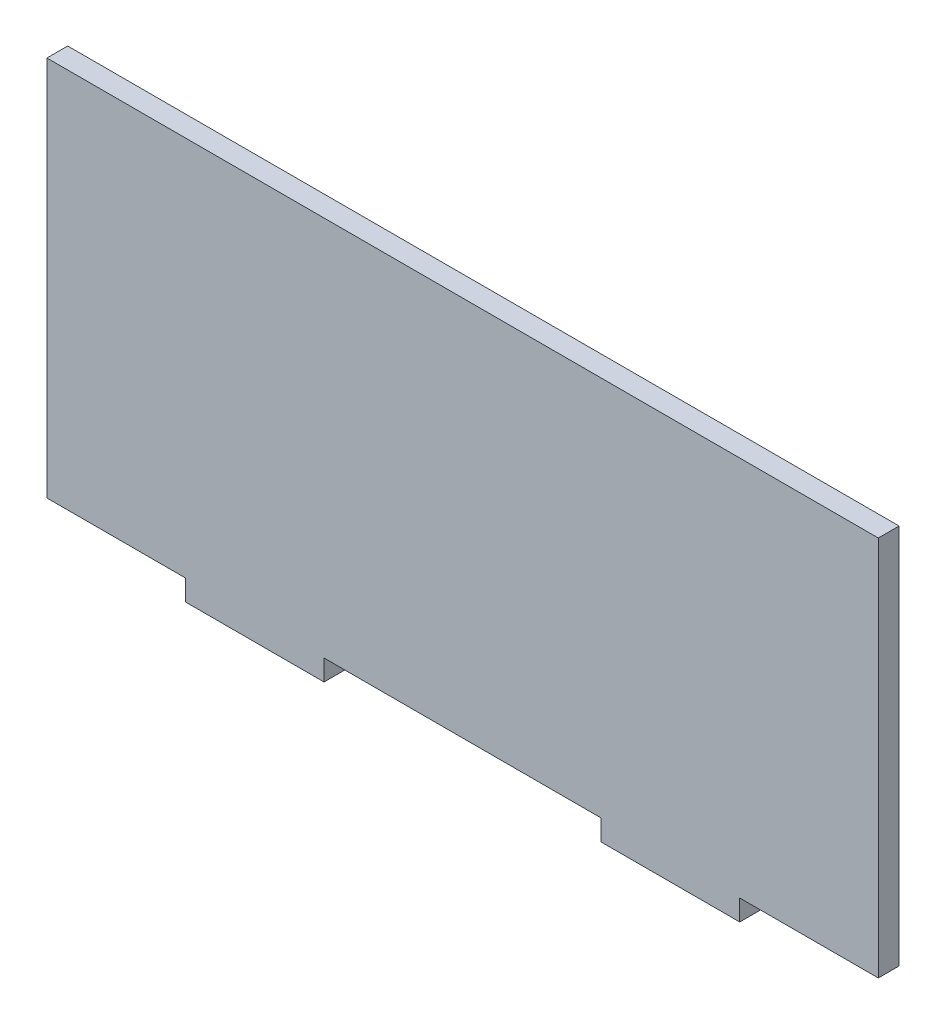
ISO-10303-21;
HEADER;
FILE_DESCRIPTION(('STEP AP214'),'2;1');
FILE_NAME('part.step','',(''),(''),'','','');
FILE_SCHEMA(('AUTOMOTIVE_DESIGN { 1 0 10303 214 1 1 1 1 }'));
ENDSEC;
DATA;
#1=APPLICATION_CONTEXT('core data for automotive mechanical design processes');
#2=APPLICATION_PROTOCOL_DEFINITION('international standard','automotive_design',2000,#1);
#3=PRODUCT_CONTEXT('',#1,'mechanical');
#4=PRODUCT('Part','Part','',(#3));
#5=PRODUCT_RELATED_PRODUCT_CATEGORY('part','',(#4));
#6=PRODUCT_DEFINITION_FORMATION('','',#4);
#7=PRODUCT_DEFINITION_CONTEXT('part definition',#1,'design');
#8=PRODUCT_DEFINITION('design','',#6,#7);
#9=PRODUCT_DEFINITION_SHAPE('','',#8);
#10=(LENGTH_UNIT() NAMED_UNIT(*) SI_UNIT(.MILLI.,.METRE.));
#11=(NAMED_UNIT(*) PLANE_ANGLE_UNIT() SI_UNIT($,.RADIAN.));
#12=(NAMED_UNIT(*) SI_UNIT($,.STERADIAN.) SOLID_ANGLE_UNIT());
#13=UNCERTAINTY_MEASURE_WITH_UNIT(LENGTH_MEASURE(1.E-05),#10,'distance_accuracy_value','');
#14=(GEOMETRIC_REPRESENTATION_CONTEXT(3) GLOBAL_UNCERTAINTY_ASSIGNED_CONTEXT((#13)) GLOBAL_UNIT_ASSIGNED_CONTEXT((#10,
#11,#12)) REPRESENTATION_CONTEXT('',''));
#15=CARTESIAN_POINT('',(0.,0.,0.));
#16=DIRECTION('',(0.,0.,1.));
#17=DIRECTION('',(1.,0.,0.));
#18=AXIS2_PLACEMENT_3D('',#15,#16,#17);
#19=CARTESIAN_POINT('',(0.,0.,-3.));
#20=DIRECTION('',(0.,-1.,0.));
#21=DIRECTION('',(0.,0.,-1.));
#22=AXIS2_PLACEMENT_3D('',#19,#20,#21);
#23=PLANE('',#22);
#24=DIRECTION('',(0.,0.,1.));
#25=VECTOR('',#24,1.);
#26=CARTESIAN_POINT('',(80.,0.,-3.));
#27=LINE('',#26,#25);
#28=CARTESIAN_POINT('',(80.,0.,-3.));
#29=VERTEX_POINT('',#28);
#30=CARTESIAN_POINT('',(80.,0.,0.));
#31=VERTEX_POINT('',#30);
#32=EDGE_CURVE('E147',#29,#31,#27,.T.);
#33=ORIENTED_EDGE('',*,*,#32,.T.);
#34=DIRECTION('',(1.,0.,0.));
#35=VECTOR('',#34,1.);
#36=CARTESIAN_POINT('',(0.,0.,0.));
#37=LINE('',#36,#35);
#38=CARTESIAN_POINT('',(40.,0.,0.));
#39=VERTEX_POINT('',#38);
#40=EDGE_CURVE('E205',#39,#31,#37,.T.);
#41=ORIENTED_EDGE('',*,*,#40,.F.);
#42=DIRECTION('',(0.,0.,1.));
#43=VECTOR('',#42,1.);
#44=CARTESIAN_POINT('',(40.,0.,-3.));
#45=LINE('',#44,#43);
#46=CARTESIAN_POINT('',(40.,0.,-3.));
#47=VERTEX_POINT('',#46);
#48=EDGE_CURVE('E178',#47,#39,#45,.T.);
#49=ORIENTED_EDGE('',*,*,#48,.F.);
#50=DIRECTION('',(1.,0.,0.));
#51=VECTOR('',#50,1.);
#52=CARTESIAN_POINT('',(0.,0.,-3.));
#53=LINE('',#52,#51);
#54=EDGE_CURVE('E192',#47,#29,#53,.T.);
#55=ORIENTED_EDGE('',*,*,#54,.T.);
#56=EDGE_LOOP('',(#33,#41,#49,#55));
#57=FACE_BOUND('',#56,.T.);
#58=ADVANCED_FACE('F33',(#57),#23,.T.);
#59=CARTESIAN_POINT('',(0.,0.,-3.));
#60=VERTEX_POINT('',#59);
#61=CARTESIAN_POINT('',(20.,0.,-3.));
#62=VERTEX_POINT('',#61);
#63=EDGE_CURVE('E188',#60,#62,#53,.T.);
#64=ORIENTED_EDGE('',*,*,#63,.T.);
#65=DIRECTION('',(0.,0.,1.));
#66=VECTOR('',#65,1.);
#67=CARTESIAN_POINT('',(20.,0.,-3.));
#68=LINE('',#67,#66);
#69=CARTESIAN_POINT('',(20.,0.,0.));
#70=VERTEX_POINT('',#69);
#71=EDGE_CURVE('E175',#62,#70,#68,.T.);
#72=ORIENTED_EDGE('',*,*,#71,.T.);
#73=CARTESIAN_POINT('',(0.,0.,0.));
#74=VERTEX_POINT('',#73);
#75=EDGE_CURVE('E201',#74,#70,#37,.T.);
#76=ORIENTED_EDGE('',*,*,#75,.F.);
#77=DIRECTION('',(0.,0.,1.));
#78=VECTOR('',#77,1.);
#79=CARTESIAN_POINT('',(0.,0.,-3.));
#80=LINE('',#79,#78);
#81=EDGE_CURVE('E37',#60,#74,#80,.T.);
#82=ORIENTED_EDGE('',*,*,#81,.F.);
#83=EDGE_LOOP('',(#64,#72,#76,#82));
#84=FACE_BOUND('',#83,.T.);
#85=ADVANCED_FACE('F221',(#84),#23,.T.);
#86=CARTESIAN_POINT('',(0.,0.,-3.));
#87=DIRECTION('',(-1.,0.,0.));
#88=DIRECTION('',(0.,0.,1.));
#89=AXIS2_PLACEMENT_3D('',#86,#87,#88);
#90=PLANE('',#89);
#91=DIRECTION('',(0.,-1.,0.));
#92=VECTOR('',#91,1.);
#93=CARTESIAN_POINT('',(0.,0.,0.));
#94=LINE('',#93,#92);
#95=CARTESIAN_POINT('',(0.,55.,0.));
#96=VERTEX_POINT('',#95);
#97=EDGE_CURVE('E177',#96,#74,#94,.T.);
#98=ORIENTED_EDGE('',*,*,#97,.F.);
#99=DIRECTION('',(0.,0.,1.));
#100=VECTOR('',#99,1.);
#101=CARTESIAN_POINT('',(0.,55.,-3.));
#102=LINE('',#101,#100);
#103=CARTESIAN_POINT('',(0.,55.,-3.));
#104=VERTEX_POINT('',#103);
#105=EDGE_CURVE('E11',#104,#96,#102,.T.);
#106=ORIENTED_EDGE('',*,*,#105,.F.);
#107=DIRECTION('',(0.,-1.,0.));
#108=VECTOR('',#107,1.);
#109=CARTESIAN_POINT('',(0.,0.,-3.));
#110=LINE('',#109,#108);
#111=EDGE_CURVE('E183',#104,#60,#110,.T.);
#112=ORIENTED_EDGE('',*,*,#111,.T.);
#113=ORIENTED_EDGE('',*,*,#81,.T.);
#114=EDGE_LOOP('',(#98,#106,#112,#113));
#115=FACE_BOUND('',#114,.T.);
#116=ADVANCED_FACE('F35',(#115),#90,.T.);
#117=CARTESIAN_POINT('',(0.,55.,-3.));
#118=DIRECTION('',(0.,1.,0.));
#119=DIRECTION('',(0.,0.,1.));
#120=AXIS2_PLACEMENT_3D('',#117,#118,#119);
#121=PLANE('',#120);
#122=DIRECTION('',(-1.,0.,0.));
#123=VECTOR('',#122,1.);
#124=CARTESIAN_POINT('',(0.,55.,0.));
#125=LINE('',#124,#123);
#126=CARTESIAN_POINT('',(120.,55.,0.));
#127=VERTEX_POINT('',#126);
#128=EDGE_CURVE('E187',#127,#96,#125,.T.);
#129=ORIENTED_EDGE('',*,*,#128,.F.);
#130=DIRECTION('',(0.,0.,1.));
#131=VECTOR('',#130,1.);
#132=CARTESIAN_POINT('',(120.,55.,-3.));
#133=LINE('',#132,#131);
#134=CARTESIAN_POINT('',(120.,55.,-3.));
#135=VERTEX_POINT('',#134);
#136=EDGE_CURVE('E42',#135,#127,#133,.T.);
#137=ORIENTED_EDGE('',*,*,#136,.F.);
#138=DIRECTION('',(-1.,0.,0.));
#139=VECTOR('',#138,1.);
#140=CARTESIAN_POINT('',(0.,55.,-3.));
#141=LINE('',#140,#139);
#142=EDGE_CURVE('E195',#135,#104,#141,.T.);
#143=ORIENTED_EDGE('',*,*,#142,.T.);
#144=ORIENTED_EDGE('',*,*,#105,.T.);
#145=EDGE_LOOP('',(#129,#137,#143,#144));
#146=FACE_BOUND('',#145,.T.);
#147=ADVANCED_FACE('F225',(#146),#121,.T.);
#148=CARTESIAN_POINT('',(120.,0.,-3.));
#149=DIRECTION('',(1.,0.,0.));
#150=DIRECTION('',(0.,0.,-1.));
#151=AXIS2_PLACEMENT_3D('',#148,#149,#150);
#152=PLANE('',#151);
#153=DIRECTION('',(0.,1.,0.));
#154=VECTOR('',#153,1.);
#155=CARTESIAN_POINT('',(120.,0.,0.));
#156=LINE('',#155,#154);
#157=CARTESIAN_POINT('',(120.,0.,0.));
#158=VERTEX_POINT('',#157);
#159=EDGE_CURVE('E204',#158,#127,#156,.T.);
#160=ORIENTED_EDGE('',*,*,#159,.F.);
#161=DIRECTION('',(0.,0.,1.));
#162=VECTOR('',#161,1.);
#163=CARTESIAN_POINT('',(120.,0.,-3.));
#164=LINE('',#163,#162);
#165=CARTESIAN_POINT('',(120.,0.,-3.));
#166=VERTEX_POINT('',#165);
#167=EDGE_CURVE('E210',#166,#158,#164,.T.);
#168=ORIENTED_EDGE('',*,*,#167,.F.);
#169=DIRECTION('',(0.,1.,0.));
#170=VECTOR('',#169,1.);
#171=CARTESIAN_POINT('',(120.,0.,-3.));
#172=LINE('',#171,#170);
#173=EDGE_CURVE('E191',#166,#135,#172,.T.);
#174=ORIENTED_EDGE('',*,*,#173,.T.);
#175=ORIENTED_EDGE('',*,*,#136,.T.);
#176=EDGE_LOOP('',(#160,#168,#174,#175));
#177=FACE_BOUND('',#176,.T.);
#178=ADVANCED_FACE('F260',(#177),#152,.T.);
#179=DIRECTION('',(0.,0.,1.));
#180=VECTOR('',#179,1.);
#181=CARTESIAN_POINT('',(100.,0.,-3.));
#182=LINE('',#181,#180);
#183=CARTESIAN_POINT('',(100.,0.,-3.));
#184=VERTEX_POINT('',#183);
#185=CARTESIAN_POINT('',(99.9999999999999,0.,0.));
#186=VERTEX_POINT('',#185);
#187=EDGE_CURVE('E156',#184,#186,#182,.T.);
#188=ORIENTED_EDGE('',*,*,#187,.F.);
#189=EDGE_CURVE('E186',#184,#166,#53,.T.);
#190=ORIENTED_EDGE('',*,*,#189,.T.);
#191=ORIENTED_EDGE('',*,*,#167,.T.);
#192=EDGE_CURVE('E200',#186,#158,#37,.T.);
#193=ORIENTED_EDGE('',*,*,#192,.F.);
#194=EDGE_LOOP('',(#188,#190,#191,#193));
#195=FACE_BOUND('',#194,.T.);
#196=ADVANCED_FACE('F242',(#195),#23,.T.);
#197=CARTESIAN_POINT('',(0.,0.,-3.));
#198=DIRECTION('',(0.,0.,-1.));
#199=DIRECTION('',(-1.,0.,0.));
#200=AXIS2_PLACEMENT_3D('',#197,#198,#199);
#201=PLANE('',#200);
#202=ORIENTED_EDGE('',*,*,#111,.F.);
#203=ORIENTED_EDGE('',*,*,#142,.F.);
#204=ORIENTED_EDGE('',*,*,#173,.F.);
#205=ORIENTED_EDGE('',*,*,#189,.F.);
#206=DIRECTION('',(0.,1.,0.));
#207=VECTOR('',#206,1.);
#208=CARTESIAN_POINT('',(100.,0.,-3.));
#209=LINE('',#208,#207);
#210=CARTESIAN_POINT('',(100.,-3.,-3.));
#211=VERTEX_POINT('',#210);
#212=EDGE_CURVE('E133',#211,#184,#209,.T.);
#213=ORIENTED_EDGE('',*,*,#212,.F.);
#214=DIRECTION('',(1.,0.,0.));
#215=VECTOR('',#214,1.);
#216=CARTESIAN_POINT('',(80.,-3.,-3.));
#217=LINE('',#216,#215);
#218=CARTESIAN_POINT('',(80.,-3.,-3.));
#219=VERTEX_POINT('',#218);
#220=EDGE_CURVE('E127',#219,#211,#217,.T.);
#221=ORIENTED_EDGE('',*,*,#220,.F.);
#222=DIRECTION('',(0.,-1.,0.));
#223=VECTOR('',#222,1.);
#224=CARTESIAN_POINT('',(80.,0.,-3.));
#225=LINE('',#224,#223);
#226=EDGE_CURVE('E141',#29,#219,#225,.T.);
#227=ORIENTED_EDGE('',*,*,#226,.F.);
#228=ORIENTED_EDGE('',*,*,#54,.F.);
#229=DIRECTION('',(0.,1.,0.));
#230=VECTOR('',#229,1.);
#231=CARTESIAN_POINT('',(40.,0.,-3.));
#232=LINE('',#231,#230);
#233=CARTESIAN_POINT('',(40.,-3.,-3.));
#234=VERTEX_POINT('',#233);
#235=EDGE_CURVE('E166',#234,#47,#232,.T.);
#236=ORIENTED_EDGE('',*,*,#235,.F.);
#237=DIRECTION('',(1.,0.,0.));
#238=VECTOR('',#237,1.);
#239=CARTESIAN_POINT('',(20.,-3.,-3.));
#240=LINE('',#239,#238);
#241=CARTESIAN_POINT('',(20.,-3.,-3.));
#242=VERTEX_POINT('',#241);
#243=EDGE_CURVE('E162',#242,#234,#240,.T.);
#244=ORIENTED_EDGE('',*,*,#243,.F.);
#245=DIRECTION('',(0.,-1.,0.));
#246=VECTOR('',#245,1.);
#247=CARTESIAN_POINT('',(20.,0.,-3.));
#248=LINE('',#247,#246);
#249=EDGE_CURVE('E159',#62,#242,#248,.T.);
#250=ORIENTED_EDGE('',*,*,#249,.F.);
#251=ORIENTED_EDGE('',*,*,#63,.F.);
#252=EDGE_LOOP('',(#202,#203,#204,#205,#213,#221,#227,#228,#236,#244,#250,#251));
#253=FACE_BOUND('',#252,.T.);
#254=ADVANCED_FACE('F139',(#253),#201,.T.);
#255=CARTESIAN_POINT('',(0.,0.,0.));
#256=DIRECTION('',(0.,0.,-1.));
#257=DIRECTION('',(-1.,0.,0.));
#258=AXIS2_PLACEMENT_3D('',#255,#256,#257);
#259=PLANE('',#258);
#260=ORIENTED_EDGE('',*,*,#97,.T.);
#261=ORIENTED_EDGE('',*,*,#75,.T.);
#262=DIRECTION('',(0.,-1.,0.));
#263=VECTOR('',#262,1.);
#264=CARTESIAN_POINT('',(20.,0.,0.));
#265=LINE('',#264,#263);
#266=CARTESIAN_POINT('',(20.,-3.,0.));
#267=VERTEX_POINT('',#266);
#268=EDGE_CURVE('E58',#70,#267,#265,.T.);
#269=ORIENTED_EDGE('',*,*,#268,.T.);
#270=DIRECTION('',(1.,0.,0.));
#271=VECTOR('',#270,1.);
#272=CARTESIAN_POINT('',(20.,-3.,0.));
#273=LINE('',#272,#271);
#274=CARTESIAN_POINT('',(40.,-3.,0.));
#275=VERTEX_POINT('',#274);
#276=EDGE_CURVE('E170',#267,#275,#273,.T.);
#277=ORIENTED_EDGE('',*,*,#276,.T.);
#278=DIRECTION('',(0.,1.,0.));
#279=VECTOR('',#278,1.);
#280=CARTESIAN_POINT('',(40.,0.,0.));
#281=LINE('',#280,#279);
#282=EDGE_CURVE('E163',#275,#39,#281,.T.);
#283=ORIENTED_EDGE('',*,*,#282,.T.);
#284=ORIENTED_EDGE('',*,*,#40,.T.);
#285=DIRECTION('',(0.,-1.,0.));
#286=VECTOR('',#285,1.);
#287=CARTESIAN_POINT('',(80.,0.,0.));
#288=LINE('',#287,#286);
#289=CARTESIAN_POINT('',(80.,-3.,0.));
#290=VERTEX_POINT('',#289);
#291=EDGE_CURVE('E152',#31,#290,#288,.T.);
#292=ORIENTED_EDGE('',*,*,#291,.T.);
#293=DIRECTION('',(1.,0.,0.));
#294=VECTOR('',#293,1.);
#295=CARTESIAN_POINT('',(80.,-3.,0.));
#296=LINE('',#295,#294);
#297=CARTESIAN_POINT('',(100.,-3.,0.));
#298=VERTEX_POINT('',#297);
#299=EDGE_CURVE('E128',#290,#298,#296,.T.);
#300=ORIENTED_EDGE('',*,*,#299,.T.);
#301=DIRECTION('',(0.,1.,0.));
#302=VECTOR('',#301,1.);
#303=CARTESIAN_POINT('',(100.,0.,0.));
#304=LINE('',#303,#302);
#305=EDGE_CURVE('E50',#298,#186,#304,.T.);
#306=ORIENTED_EDGE('',*,*,#305,.T.);
#307=ORIENTED_EDGE('',*,*,#192,.T.);
#308=ORIENTED_EDGE('',*,*,#159,.T.);
#309=ORIENTED_EDGE('',*,*,#128,.T.);
#310=EDGE_LOOP('',(#260,#261,#269,#277,#283,#284,#292,#300,#306,#307,#308,#309));
#311=FACE_BOUND('',#310,.T.);
#312=ADVANCED_FACE('F222',(#311),#259,.F.);
#313=CARTESIAN_POINT('',(20.,0.,-3.));
#314=DIRECTION('',(-1.,0.,0.));
#315=DIRECTION('',(0.,0.,1.));
#316=AXIS2_PLACEMENT_3D('',#313,#314,#315);
#317=PLANE('',#316);
#318=ORIENTED_EDGE('',*,*,#268,.F.);
#319=ORIENTED_EDGE('',*,*,#71,.F.);
#320=ORIENTED_EDGE('',*,*,#249,.T.);
#321=DIRECTION('',(0.,0.,1.));
#322=VECTOR('',#321,1.);
#323=CARTESIAN_POINT('',(20.,-3.,-3.));
#324=LINE('',#323,#322);
#325=EDGE_CURVE('E168',#242,#267,#324,.T.);
#326=ORIENTED_EDGE('',*,*,#325,.T.);
#327=EDGE_LOOP('',(#318,#319,#320,#326));
#328=FACE_BOUND('',#327,.T.);
#329=ADVANCED_FACE('F231',(#328),#317,.T.);
#330=CARTESIAN_POINT('',(40.,0.,-3.));
#331=DIRECTION('',(1.,0.,0.));
#332=DIRECTION('',(0.,0.,-1.));
#333=AXIS2_PLACEMENT_3D('',#330,#331,#332);
#334=PLANE('',#333);
#335=ORIENTED_EDGE('',*,*,#282,.F.);
#336=DIRECTION('',(0.,0.,1.));
#337=VECTOR('',#336,1.);
#338=CARTESIAN_POINT('',(40.,-3.,-3.));
#339=LINE('',#338,#337);
#340=EDGE_CURVE('E180',#234,#275,#339,.T.);
#341=ORIENTED_EDGE('',*,*,#340,.F.);
#342=ORIENTED_EDGE('',*,*,#235,.T.);
#343=ORIENTED_EDGE('',*,*,#48,.T.);
#344=EDGE_LOOP('',(#335,#341,#342,#343));
#345=FACE_BOUND('',#344,.T.);
#346=ADVANCED_FACE('F244',(#345),#334,.T.);
#347=CARTESIAN_POINT('',(20.,-3.,-3.));
#348=DIRECTION('',(0.,-1.,0.));
#349=DIRECTION('',(0.,0.,-1.));
#350=AXIS2_PLACEMENT_3D('',#347,#348,#349);
#351=PLANE('',#350);
#352=ORIENTED_EDGE('',*,*,#276,.F.);
#353=ORIENTED_EDGE('',*,*,#325,.F.);
#354=ORIENTED_EDGE('',*,*,#243,.T.);
#355=ORIENTED_EDGE('',*,*,#340,.T.);
#356=EDGE_LOOP('',(#352,#353,#354,#355));
#357=FACE_BOUND('',#356,.T.);
#358=ADVANCED_FACE('F234',(#357),#351,.T.);
#359=CARTESIAN_POINT('',(80.,0.,-3.));
#360=DIRECTION('',(-1.,0.,0.));
#361=DIRECTION('',(0.,0.,1.));
#362=AXIS2_PLACEMENT_3D('',#359,#360,#361);
#363=PLANE('',#362);
#364=ORIENTED_EDGE('',*,*,#291,.F.);
#365=ORIENTED_EDGE('',*,*,#32,.F.);
#366=ORIENTED_EDGE('',*,*,#226,.T.);
#367=DIRECTION('',(0.,0.,1.));
#368=VECTOR('',#367,1.);
#369=CARTESIAN_POINT('',(80.,-3.,-3.));
#370=LINE('',#369,#368);
#371=EDGE_CURVE('E124',#219,#290,#370,.T.);
#372=ORIENTED_EDGE('',*,*,#371,.T.);
#373=EDGE_LOOP('',(#364,#365,#366,#372));
#374=FACE_BOUND('',#373,.T.);
#375=ADVANCED_FACE('F145',(#374),#363,.T.);
#376=CARTESIAN_POINT('',(100.,0.,-3.));
#377=DIRECTION('',(1.,0.,0.));
#378=DIRECTION('',(0.,0.,-1.));
#379=AXIS2_PLACEMENT_3D('',#376,#377,#378);
#380=PLANE('',#379);
#381=ORIENTED_EDGE('',*,*,#305,.F.);
#382=DIRECTION('',(0.,0.,1.));
#383=VECTOR('',#382,1.);
#384=CARTESIAN_POINT('',(100.,-3.,-3.));
#385=LINE('',#384,#383);
#386=EDGE_CURVE('E132',#211,#298,#385,.T.);
#387=ORIENTED_EDGE('',*,*,#386,.F.);
#388=ORIENTED_EDGE('',*,*,#212,.T.);
#389=ORIENTED_EDGE('',*,*,#187,.T.);
#390=EDGE_LOOP('',(#381,#387,#388,#389));
#391=FACE_BOUND('',#390,.T.);
#392=ADVANCED_FACE('F300',(#391),#380,.T.);
#393=CARTESIAN_POINT('',(80.,-3.,-3.));
#394=DIRECTION('',(0.,-1.,0.));
#395=DIRECTION('',(0.,0.,-1.));
#396=AXIS2_PLACEMENT_3D('',#393,#394,#395);
#397=PLANE('',#396);
#398=ORIENTED_EDGE('',*,*,#299,.F.);
#399=ORIENTED_EDGE('',*,*,#371,.F.);
#400=ORIENTED_EDGE('',*,*,#220,.T.);
#401=ORIENTED_EDGE('',*,*,#386,.T.);
#402=EDGE_LOOP('',(#398,#399,#400,#401));
#403=FACE_BOUND('',#402,.T.);
#404=ADVANCED_FACE('F126',(#403),#397,.T.);
#405=CLOSED_SHELL('',(#58,#85,#116,#147,#178,#196,#254,#312,#329,#346,#358,#375,#392,#404));
#406=MANIFOLD_SOLID_BREP('B2',#405);
#407=ADVANCED_BREP_SHAPE_REPRESENTATION('',(#18,#406),#14);
#408=SHAPE_DEFINITION_REPRESENTATION(#9,#407);
ENDSEC;
END-ISO-10303-21;
